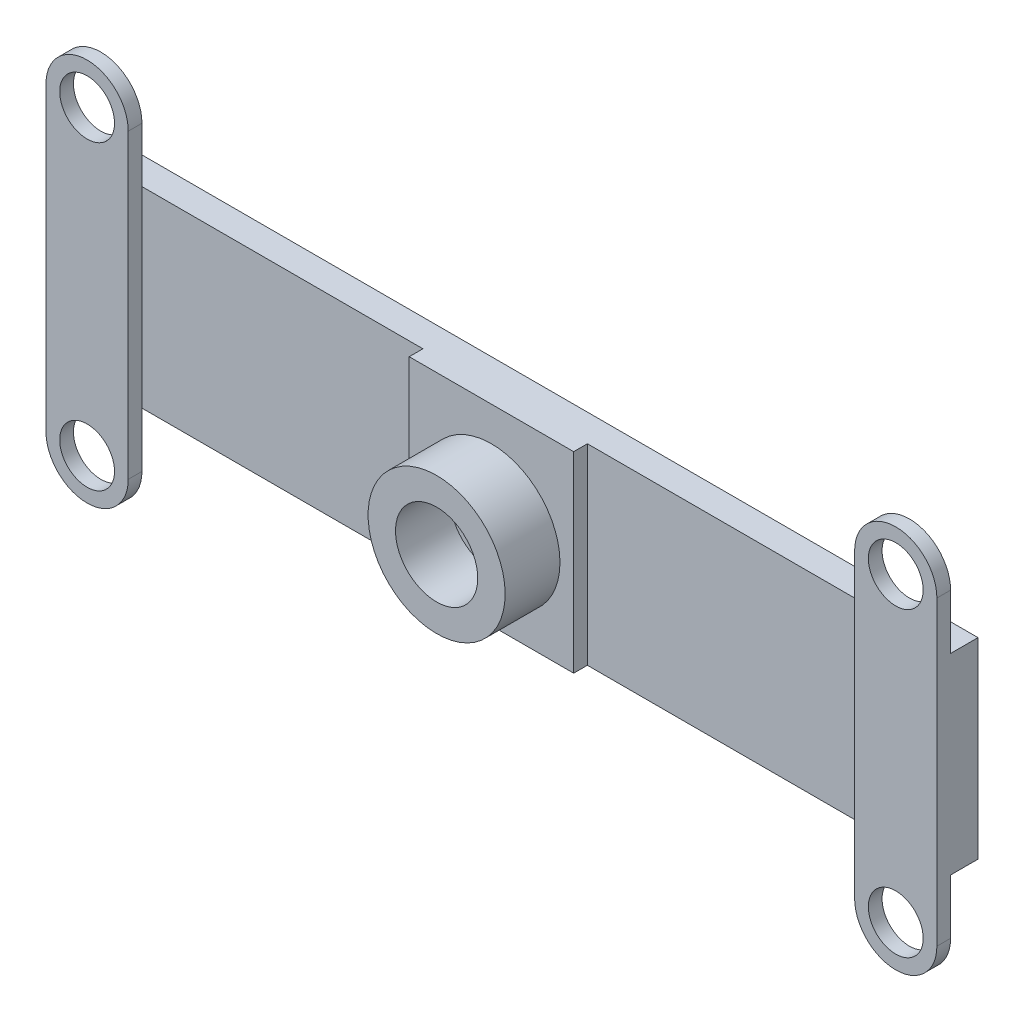
ISO-10303-21;
HEADER;
FILE_DESCRIPTION(('STEP AP214'),'2;1');
FILE_NAME('part.step','',(''),(''),'','','');
FILE_SCHEMA(('AUTOMOTIVE_DESIGN { 1 0 10303 214 1 1 1 1 }'));
ENDSEC;
DATA;
#1=APPLICATION_CONTEXT('core data for automotive mechanical design processes');
#2=APPLICATION_PROTOCOL_DEFINITION('international standard','automotive_design',2000,#1);
#3=PRODUCT_CONTEXT('',#1,'mechanical');
#4=PRODUCT('Part','Part','',(#3));
#5=PRODUCT_RELATED_PRODUCT_CATEGORY('part','',(#4));
#6=PRODUCT_DEFINITION_FORMATION('','',#4);
#7=PRODUCT_DEFINITION_CONTEXT('part definition',#1,'design');
#8=PRODUCT_DEFINITION('design','',#6,#7);
#9=PRODUCT_DEFINITION_SHAPE('','',#8);
#10=(LENGTH_UNIT() NAMED_UNIT(*) SI_UNIT(.MILLI.,.METRE.));
#11=(NAMED_UNIT(*) PLANE_ANGLE_UNIT() SI_UNIT($,.RADIAN.));
#12=(NAMED_UNIT(*) SI_UNIT($,.STERADIAN.) SOLID_ANGLE_UNIT());
#13=UNCERTAINTY_MEASURE_WITH_UNIT(LENGTH_MEASURE(1.E-05),#10,'distance_accuracy_value','');
#14=(GEOMETRIC_REPRESENTATION_CONTEXT(3) GLOBAL_UNCERTAINTY_ASSIGNED_CONTEXT((#13)) GLOBAL_UNIT_ASSIGNED_CONTEXT((#10,
#11,#12)) REPRESENTATION_CONTEXT('',''));
#15=CARTESIAN_POINT('',(0.,0.,0.));
#16=DIRECTION('',(0.,0.,1.));
#17=DIRECTION('',(1.,0.,0.));
#18=AXIS2_PLACEMENT_3D('',#15,#16,#17);
#19=CARTESIAN_POINT('',(0.,0.,3.));
#20=DIRECTION('',(0.,0.,1.));
#21=DIRECTION('',(1.,0.,0.));
#22=AXIS2_PLACEMENT_3D('',#19,#20,#21);
#23=PLANE('',#22);
#24=CARTESIAN_POINT('',(-6.93546936709995,10.3214865942249,3.));
#25=DIRECTION('',(0.,0.,1.));
#26=DIRECTION('',(1.,0.,0.));
#27=AXIS2_PLACEMENT_3D('',#24,#25,#26);
#28=CIRCLE('',#27,2.);
#29=CARTESIAN_POINT('',(-4.93546936709994,10.3214865942249,3.));
#30=VERTEX_POINT('',#29);
#31=EDGE_CURVE('E240',#30,#30,#28,.T.);
#32=ORIENTED_EDGE('',*,*,#31,.F.);
#33=EDGE_LOOP('',(#32));
#34=FACE_BOUND('',#33,.T.);
#35=CARTESIAN_POINT('',(-6.93546936709995,9.82148659422492,3.));
#36=DIRECTION('',(0.,0.,1.));
#37=DIRECTION('',(1.,0.,0.));
#38=AXIS2_PLACEMENT_3D('',#35,#36,#37);
#39=CIRCLE('',#38,3.);
#40=CARTESIAN_POINT('',(-3.93546936709995,9.82148659422492,3.));
#41=VERTEX_POINT('',#40);
#42=EDGE_CURVE('E361',#41,#41,#39,.T.);
#43=ORIENTED_EDGE('',*,*,#42,.T.);
#44=EDGE_LOOP('',(#43));
#45=FACE_BOUND('',#44,.T.);
#46=ADVANCED_FACE('F33',(#34,#45),#23,.T.);
#47=CARTESIAN_POINT('',(0.,0.,2.));
#48=DIRECTION('',(0.,0.,1.));
#49=DIRECTION('',(1.,0.,0.));
#50=AXIS2_PLACEMENT_3D('',#47,#48,#49);
#51=PLANE('',#50);
#52=DIRECTION('',(1.,0.,0.));
#53=VECTOR('',#52,1.);
#54=CARTESIAN_POINT('',(-39.4354693670999,3.32148659422492,2.));
#55=LINE('',#54,#53);
#56=CARTESIAN_POINT('',(-0.935469367099942,3.32148659422492,2.));
#57=VERTEX_POINT('',#56);
#58=CARTESIAN_POINT('',(19.5645306329001,3.32148659422492,2.));
#59=VERTEX_POINT('',#58);
#60=EDGE_CURVE('E279',#57,#59,#55,.T.);
#61=ORIENTED_EDGE('',*,*,#60,.T.);
#62=DIRECTION('',(0.,-1.,0.));
#63=VECTOR('',#62,1.);
#64=CARTESIAN_POINT('',(19.5645306329001,21.3214865942249,2.));
#65=LINE('',#64,#63);
#66=CARTESIAN_POINT('',(19.5645306329001,17.3214865942249,2.));
#67=VERTEX_POINT('',#66);
#68=EDGE_CURVE('E339',#67,#59,#65,.T.);
#69=ORIENTED_EDGE('',*,*,#68,.F.);
#70=DIRECTION('',(-1.,0.,0.));
#71=VECTOR('',#70,1.);
#72=CARTESIAN_POINT('',(-39.4354693670999,17.3214865942249,2.));
#73=LINE('',#72,#71);
#74=CARTESIAN_POINT('',(-0.935469367099942,17.3214865942249,2.));
#75=VERTEX_POINT('',#74);
#76=EDGE_CURVE('E284',#67,#75,#73,.T.);
#77=ORIENTED_EDGE('',*,*,#76,.T.);
#78=DIRECTION('',(0.,1.,0.));
#79=VECTOR('',#78,1.);
#80=CARTESIAN_POINT('',(-0.935469367099942,17.3214865942249,2.));
#81=LINE('',#80,#79);
#82=EDGE_CURVE('E248',#57,#75,#81,.T.);
#83=ORIENTED_EDGE('',*,*,#82,.F.);
#84=EDGE_LOOP('',(#61,#69,#77,#83));
#85=FACE_BOUND('',#84,.T.);
#86=ADVANCED_FACE('F387',(#85),#51,.T.);
#87=CARTESIAN_POINT('',(-12.9354693671,17.3214865942249,2.));
#88=VERTEX_POINT('',#87);
#89=CARTESIAN_POINT('',(-33.4354693670999,17.3214865942249,2.));
#90=VERTEX_POINT('',#89);
#91=EDGE_CURVE('E285',#88,#90,#73,.T.);
#92=ORIENTED_EDGE('',*,*,#91,.T.);
#93=DIRECTION('',(0.,1.,0.));
#94=VECTOR('',#93,1.);
#95=CARTESIAN_POINT('',(-33.4354693670999,21.3214865942249,2.));
#96=LINE('',#95,#94);
#97=CARTESIAN_POINT('',(-33.4354693670999,3.32148659422492,2.));
#98=VERTEX_POINT('',#97);
#99=EDGE_CURVE('E57',#98,#90,#96,.T.);
#100=ORIENTED_EDGE('',*,*,#99,.F.);
#101=CARTESIAN_POINT('',(-12.9354693671,3.32148659422492,2.));
#102=VERTEX_POINT('',#101);
#103=EDGE_CURVE('E278',#98,#102,#55,.T.);
#104=ORIENTED_EDGE('',*,*,#103,.T.);
#105=DIRECTION('',(0.,-1.,0.));
#106=VECTOR('',#105,1.);
#107=CARTESIAN_POINT('',(-12.9354693671,17.3214865942249,2.));
#108=LINE('',#107,#106);
#109=EDGE_CURVE('E243',#88,#102,#108,.T.);
#110=ORIENTED_EDGE('',*,*,#109,.F.);
#111=EDGE_LOOP('',(#92,#100,#104,#110));
#112=FACE_BOUND('',#111,.T.);
#113=ADVANCED_FACE('F394',(#112),#51,.T.);
#114=CARTESIAN_POINT('',(0.,0.,0.));
#115=DIRECTION('',(0.,0.,1.));
#116=DIRECTION('',(1.,0.,0.));
#117=AXIS2_PLACEMENT_3D('',#114,#115,#116);
#118=PLANE('',#117);
#119=DIRECTION('',(0.,-1.,0.));
#120=VECTOR('',#119,1.);
#121=CARTESIAN_POINT('',(-39.4354693670999,17.3214865942249,0.));
#122=LINE('',#121,#120);
#123=CARTESIAN_POINT('',(-39.4354693670999,17.3214865942249,0.));
#124=VERTEX_POINT('',#123);
#125=CARTESIAN_POINT('',(-39.4354693670999,3.32148659422492,0.));
#126=VERTEX_POINT('',#125);
#127=EDGE_CURVE('E273',#124,#126,#122,.T.);
#128=ORIENTED_EDGE('',*,*,#127,.F.);
#129=DIRECTION('',(-1.,0.,0.));
#130=VECTOR('',#129,1.);
#131=CARTESIAN_POINT('',(-39.4354693670999,17.3214865942249,0.));
#132=LINE('',#131,#130);
#133=CARTESIAN_POINT('',(25.5645306329001,17.3214865942249,0.));
#134=VERTEX_POINT('',#133);
#135=EDGE_CURVE('E292',#134,#124,#132,.T.);
#136=ORIENTED_EDGE('',*,*,#135,.F.);
#137=DIRECTION('',(0.,1.,0.));
#138=VECTOR('',#137,1.);
#139=CARTESIAN_POINT('',(25.5645306329001,17.3214865942249,0.));
#140=LINE('',#139,#138);
#141=CARTESIAN_POINT('',(25.5645306329001,3.32148659422492,0.));
#142=VERTEX_POINT('',#141);
#143=EDGE_CURVE('E290',#142,#134,#140,.T.);
#144=ORIENTED_EDGE('',*,*,#143,.F.);
#145=DIRECTION('',(1.,0.,0.));
#146=VECTOR('',#145,1.);
#147=CARTESIAN_POINT('',(-39.4354693670999,3.32148659422492,0.));
#148=LINE('',#147,#146);
#149=EDGE_CURVE('E288',#126,#142,#148,.T.);
#150=ORIENTED_EDGE('',*,*,#149,.F.);
#151=EDGE_LOOP('',(#128,#136,#144,#150));
#152=FACE_BOUND('',#151,.T.);
#153=CARTESIAN_POINT('',(-6.93546936709995,10.3214865942249,0.));
#154=DIRECTION('',(0.,0.,1.));
#155=DIRECTION('',(1.,0.,0.));
#156=AXIS2_PLACEMENT_3D('',#153,#154,#155);
#157=CIRCLE('',#156,2.);
#158=CARTESIAN_POINT('',(-4.93546936709995,10.3214865942249,0.));
#159=VERTEX_POINT('',#158);
#160=EDGE_CURVE('E270',#159,#159,#157,.T.);
#161=ORIENTED_EDGE('',*,*,#160,.T.);
#162=EDGE_LOOP('',(#161));
#163=FACE_BOUND('',#162,.T.);
#164=ADVANCED_FACE('F311',(#152,#163),#118,.F.);
#165=CARTESIAN_POINT('',(-39.4354693670999,17.3214865942249,2.));
#166=DIRECTION('',(1.,0.,0.));
#167=DIRECTION('',(0.,0.,-1.));
#168=AXIS2_PLACEMENT_3D('',#165,#166,#167);
#169=PLANE('',#168);
#170=ORIENTED_EDGE('',*,*,#127,.T.);
#171=DIRECTION('',(0.,0.,-1.));
#172=VECTOR('',#171,1.);
#173=CARTESIAN_POINT('',(-39.4354693670999,3.32148659422492,2.));
#174=LINE('',#173,#172);
#175=CARTESIAN_POINT('',(-39.4354693670999,3.32148659422492,2.));
#176=VERTEX_POINT('',#175);
#177=EDGE_CURVE('E37',#176,#126,#174,.T.);
#178=ORIENTED_EDGE('',*,*,#177,.F.);
#179=DIRECTION('',(0.,-1.,0.));
#180=VECTOR('',#179,1.);
#181=CARTESIAN_POINT('',(-39.4354693671,21.3214865942249,2.));
#182=LINE('',#181,#180);
#183=CARTESIAN_POINT('',(-39.4354693671,-0.678513405775075,2.));
#184=VERTEX_POINT('',#183);
#185=EDGE_CURVE('E226',#176,#184,#182,.T.);
#186=ORIENTED_EDGE('',*,*,#185,.T.);
#187=DIRECTION('',(0.,0.,-1.));
#188=VECTOR('',#187,1.);
#189=CARTESIAN_POINT('',(-39.4354693671,-0.678513405775075,3.));
#190=LINE('',#189,#188);
#191=CARTESIAN_POINT('',(-39.4354693671,-0.678513405775075,3.));
#192=VERTEX_POINT('',#191);
#193=EDGE_CURVE('E217',#192,#184,#190,.T.);
#194=ORIENTED_EDGE('',*,*,#193,.F.);
#195=DIRECTION('',(0.,-1.,0.));
#196=VECTOR('',#195,1.);
#197=CARTESIAN_POINT('',(-39.4354693671,21.3214865942249,3.));
#198=LINE('',#197,#196);
#199=CARTESIAN_POINT('',(-39.4354693671,21.3214865942249,3.));
#200=VERTEX_POINT('',#199);
#201=EDGE_CURVE('E215',#200,#192,#198,.T.);
#202=ORIENTED_EDGE('',*,*,#201,.F.);
#203=DIRECTION('',(0.,0.,-1.));
#204=VECTOR('',#203,1.);
#205=CARTESIAN_POINT('',(-39.4354693671,21.3214865942249,3.));
#206=LINE('',#205,#204);
#207=CARTESIAN_POINT('',(-39.4354693671,21.3214865942249,2.));
#208=VERTEX_POINT('',#207);
#209=EDGE_CURVE('E231',#200,#208,#206,.T.);
#210=ORIENTED_EDGE('',*,*,#209,.T.);
#211=CARTESIAN_POINT('',(-39.4354693671,17.3214865942249,2.));
#212=VERTEX_POINT('',#211);
#213=EDGE_CURVE('E211',#208,#212,#182,.T.);
#214=ORIENTED_EDGE('',*,*,#213,.T.);
#215=DIRECTION('',(0.,0.,-1.));
#216=VECTOR('',#215,1.);
#217=CARTESIAN_POINT('',(-39.4354693670999,17.3214865942249,2.));
#218=LINE('',#217,#216);
#219=EDGE_CURVE('E283',#212,#124,#218,.T.);
#220=ORIENTED_EDGE('',*,*,#219,.T.);
#221=EDGE_LOOP('',(#170,#178,#186,#194,#202,#210,#214,#220));
#222=FACE_BOUND('',#221,.T.);
#223=ADVANCED_FACE('F35',(#222),#169,.F.);
#224=CARTESIAN_POINT('',(-39.4354693670999,3.32148659422492,2.));
#225=DIRECTION('',(0.,1.,0.));
#226=DIRECTION('',(0.,0.,1.));
#227=AXIS2_PLACEMENT_3D('',#224,#225,#226);
#228=PLANE('',#227);
#229=ORIENTED_EDGE('',*,*,#149,.T.);
#230=DIRECTION('',(0.,0.,-1.));
#231=VECTOR('',#230,1.);
#232=CARTESIAN_POINT('',(25.5645306329001,3.32148659422492,2.));
#233=LINE('',#232,#231);
#234=CARTESIAN_POINT('',(25.5645306329001,3.32148659422492,2.));
#235=VERTEX_POINT('',#234);
#236=EDGE_CURVE('E298',#235,#142,#233,.T.);
#237=ORIENTED_EDGE('',*,*,#236,.F.);
#238=DIRECTION('',(1.,0.,0.));
#239=VECTOR('',#238,1.);
#240=CARTESIAN_POINT('',(-39.4354693670999,3.32148659422492,2.));
#241=LINE('',#240,#239);
#242=EDGE_CURVE('E49',#59,#235,#241,.T.);
#243=ORIENTED_EDGE('',*,*,#242,.F.);
#244=ORIENTED_EDGE('',*,*,#60,.F.);
#245=DIRECTION('',(0.,0.,-1.));
#246=VECTOR('',#245,1.);
#247=CARTESIAN_POINT('',(-0.935469367099942,3.32148659422492,3.));
#248=LINE('',#247,#246);
#249=CARTESIAN_POINT('',(-0.935469367099942,3.32148659422492,3.));
#250=VERTEX_POINT('',#249);
#251=EDGE_CURVE('E264',#250,#57,#248,.T.);
#252=ORIENTED_EDGE('',*,*,#251,.F.);
#253=DIRECTION('',(1.,0.,0.));
#254=VECTOR('',#253,1.);
#255=CARTESIAN_POINT('',(-12.9354693670999,3.32148659422492,3.));
#256=LINE('',#255,#254);
#257=CARTESIAN_POINT('',(-12.9354693670999,3.32148659422492,3.));
#258=VERTEX_POINT('',#257);
#259=EDGE_CURVE('E247',#258,#250,#256,.T.);
#260=ORIENTED_EDGE('',*,*,#259,.F.);
#261=DIRECTION('',(0.,0.,-1.));
#262=VECTOR('',#261,1.);
#263=CARTESIAN_POINT('',(-12.9354693670999,3.32148659422492,3.));
#264=LINE('',#263,#262);
#265=EDGE_CURVE('E267',#258,#102,#264,.T.);
#266=ORIENTED_EDGE('',*,*,#265,.T.);
#267=ORIENTED_EDGE('',*,*,#103,.F.);
#268=EDGE_CURVE('E274',#176,#98,#55,.T.);
#269=ORIENTED_EDGE('',*,*,#268,.F.);
#270=ORIENTED_EDGE('',*,*,#177,.T.);
#271=EDGE_LOOP('',(#229,#237,#243,#244,#252,#260,#266,#267,#269,#270));
#272=FACE_BOUND('',#271,.T.);
#273=ADVANCED_FACE('F305',(#272),#228,.F.);
#274=CARTESIAN_POINT('',(25.5645306329001,17.3214865942249,2.));
#275=DIRECTION('',(-1.,0.,0.));
#276=DIRECTION('',(0.,0.,1.));
#277=AXIS2_PLACEMENT_3D('',#274,#275,#276);
#278=PLANE('',#277);
#279=ORIENTED_EDGE('',*,*,#143,.T.);
#280=DIRECTION('',(0.,0.,-1.));
#281=VECTOR('',#280,1.);
#282=CARTESIAN_POINT('',(25.5645306329001,17.3214865942249,2.));
#283=LINE('',#282,#281);
#284=CARTESIAN_POINT('',(25.5645306329001,17.3214865942249,2.));
#285=VERTEX_POINT('',#284);
#286=EDGE_CURVE('E296',#285,#134,#283,.T.);
#287=ORIENTED_EDGE('',*,*,#286,.F.);
#288=DIRECTION('',(0.,1.,0.));
#289=VECTOR('',#288,1.);
#290=CARTESIAN_POINT('',(25.5645306329001,21.3214865942249,2.));
#291=LINE('',#290,#289);
#292=CARTESIAN_POINT('',(25.5645306329001,21.3214865942249,2.));
#293=VERTEX_POINT('',#292);
#294=EDGE_CURVE('E320',#285,#293,#291,.T.);
#295=ORIENTED_EDGE('',*,*,#294,.T.);
#296=DIRECTION('',(0.,0.,-1.));
#297=VECTOR('',#296,1.);
#298=CARTESIAN_POINT('',(25.5645306329001,21.3214865942249,3.));
#299=LINE('',#298,#297);
#300=CARTESIAN_POINT('',(25.5645306329001,21.3214865942249,3.));
#301=VERTEX_POINT('',#300);
#302=EDGE_CURVE('E328',#301,#293,#299,.T.);
#303=ORIENTED_EDGE('',*,*,#302,.F.);
#304=DIRECTION('',(0.,1.,0.));
#305=VECTOR('',#304,1.);
#306=CARTESIAN_POINT('',(25.5645306329001,21.3214865942249,3.));
#307=LINE('',#306,#305);
#308=CARTESIAN_POINT('',(25.5645306329001,-0.678513405775086,3.));
#309=VERTEX_POINT('',#308);
#310=EDGE_CURVE('E179',#309,#301,#307,.T.);
#311=ORIENTED_EDGE('',*,*,#310,.F.);
#312=DIRECTION('',(0.,0.,-1.));
#313=VECTOR('',#312,1.);
#314=CARTESIAN_POINT('',(25.5645306329001,-0.678513405775086,3.));
#315=LINE('',#314,#313);
#316=CARTESIAN_POINT('',(25.5645306329001,-0.678513405775086,2.));
#317=VERTEX_POINT('',#316);
#318=EDGE_CURVE('E191',#309,#317,#315,.T.);
#319=ORIENTED_EDGE('',*,*,#318,.T.);
#320=EDGE_CURVE('E183',#317,#235,#291,.T.);
#321=ORIENTED_EDGE('',*,*,#320,.T.);
#322=ORIENTED_EDGE('',*,*,#236,.T.);
#323=EDGE_LOOP('',(#279,#287,#295,#303,#311,#319,#321,#322));
#324=FACE_BOUND('',#323,.T.);
#325=ADVANCED_FACE('F313',(#324),#278,.F.);
#326=CARTESIAN_POINT('',(-39.4354693670999,17.3214865942249,2.));
#327=DIRECTION('',(0.,-1.,0.));
#328=DIRECTION('',(0.,0.,-1.));
#329=AXIS2_PLACEMENT_3D('',#326,#327,#328);
#330=PLANE('',#329);
#331=ORIENTED_EDGE('',*,*,#135,.T.);
#332=ORIENTED_EDGE('',*,*,#219,.F.);
#333=EDGE_CURVE('E277',#90,#212,#73,.T.);
#334=ORIENTED_EDGE('',*,*,#333,.F.);
#335=ORIENTED_EDGE('',*,*,#91,.F.);
#336=DIRECTION('',(0.,0.,-1.));
#337=VECTOR('',#336,1.);
#338=CARTESIAN_POINT('',(-12.9354693671,17.3214865942249,3.));
#339=LINE('',#338,#337);
#340=CARTESIAN_POINT('',(-12.9354693671,17.3214865942249,3.));
#341=VERTEX_POINT('',#340);
#342=EDGE_CURVE('E254',#341,#88,#339,.T.);
#343=ORIENTED_EDGE('',*,*,#342,.F.);
#344=DIRECTION('',(-1.,0.,0.));
#345=VECTOR('',#344,1.);
#346=CARTESIAN_POINT('',(-12.9354693671,17.3214865942249,3.));
#347=LINE('',#346,#345);
#348=CARTESIAN_POINT('',(-0.935469367099942,17.3214865942249,3.));
#349=VERTEX_POINT('',#348);
#350=EDGE_CURVE('E252',#349,#341,#347,.T.);
#351=ORIENTED_EDGE('',*,*,#350,.F.);
#352=DIRECTION('',(0.,0.,-1.));
#353=VECTOR('',#352,1.);
#354=CARTESIAN_POINT('',(-0.935469367099942,17.3214865942249,3.));
#355=LINE('',#354,#353);
#356=EDGE_CURVE('E261',#349,#75,#355,.T.);
#357=ORIENTED_EDGE('',*,*,#356,.T.);
#358=ORIENTED_EDGE('',*,*,#76,.F.);
#359=EDGE_CURVE('E280',#285,#67,#73,.T.);
#360=ORIENTED_EDGE('',*,*,#359,.F.);
#361=ORIENTED_EDGE('',*,*,#286,.T.);
#362=EDGE_LOOP('',(#331,#332,#334,#335,#343,#351,#357,#358,#360,#361));
#363=FACE_BOUND('',#362,.T.);
#364=ADVANCED_FACE('F316',(#363),#330,.F.);
#365=CARTESIAN_POINT('',(-6.93546936709995,10.3214865942249,2.));
#366=DIRECTION('',(0.,0.,-1.));
#367=DIRECTION('',(-1.,0.,0.));
#368=AXIS2_PLACEMENT_3D('',#365,#366,#367);
#369=CYLINDRICAL_SURFACE('',#368,2.);
#370=ORIENTED_EDGE('',*,*,#160,.F.);
#371=EDGE_LOOP('',(#370));
#372=FACE_BOUND('',#371,.T.);
#373=ORIENTED_EDGE('',*,*,#31,.T.);
#374=EDGE_LOOP('',(#373));
#375=FACE_BOUND('',#374,.T.);
#376=ADVANCED_FACE('F402',(#372,#375),#369,.F.);
#377=CARTESIAN_POINT('',(-6.93546936709995,9.82148659422492,3.));
#378=DIRECTION('',(0.,0.,1.));
#379=DIRECTION('',(1.,0.,0.));
#380=AXIS2_PLACEMENT_3D('',#377,#378,#379);
#381=CIRCLE('',#380,5.);
#382=CARTESIAN_POINT('',(-1.93546936709995,9.82148659422492,3.));
#383=VERTEX_POINT('',#382);
#384=EDGE_CURVE('E11',#383,#383,#381,.T.);
#385=ORIENTED_EDGE('',*,*,#384,.F.);
#386=EDGE_LOOP('',(#385));
#387=FACE_BOUND('',#386,.T.);
#388=DIRECTION('',(0.,-1.,0.));
#389=VECTOR('',#388,1.);
#390=CARTESIAN_POINT('',(-12.9354693671,17.3214865942249,3.));
#391=LINE('',#390,#389);
#392=EDGE_CURVE('E244',#341,#258,#391,.T.);
#393=ORIENTED_EDGE('',*,*,#392,.T.);
#394=ORIENTED_EDGE('',*,*,#259,.T.);
#395=DIRECTION('',(0.,1.,0.));
#396=VECTOR('',#395,1.);
#397=CARTESIAN_POINT('',(-0.935469367099942,17.3214865942249,3.));
#398=LINE('',#397,#396);
#399=EDGE_CURVE('E250',#250,#349,#398,.T.);
#400=ORIENTED_EDGE('',*,*,#399,.T.);
#401=ORIENTED_EDGE('',*,*,#350,.T.);
#402=EDGE_LOOP('',(#393,#394,#400,#401));
#403=FACE_BOUND('',#402,.T.);
#404=ADVANCED_FACE('F390',(#387,#403),#23,.T.);
#405=CARTESIAN_POINT('',(-12.9354693671,17.3214865942249,3.));
#406=DIRECTION('',(1.,0.,0.));
#407=DIRECTION('',(0.,1.,0.));
#408=AXIS2_PLACEMENT_3D('',#405,#406,#407);
#409=PLANE('',#408);
#410=ORIENTED_EDGE('',*,*,#109,.T.);
#411=ORIENTED_EDGE('',*,*,#265,.F.);
#412=ORIENTED_EDGE('',*,*,#392,.F.);
#413=ORIENTED_EDGE('',*,*,#342,.T.);
#414=EDGE_LOOP('',(#410,#411,#412,#413));
#415=FACE_BOUND('',#414,.T.);
#416=ADVANCED_FACE('F401',(#415),#409,.F.);
#417=CARTESIAN_POINT('',(-0.935469367099942,17.3214865942249,3.));
#418=DIRECTION('',(-1.,0.,0.));
#419=DIRECTION('',(0.,0.,1.));
#420=AXIS2_PLACEMENT_3D('',#417,#418,#419);
#421=PLANE('',#420);
#422=ORIENTED_EDGE('',*,*,#82,.T.);
#423=ORIENTED_EDGE('',*,*,#356,.F.);
#424=ORIENTED_EDGE('',*,*,#399,.F.);
#425=ORIENTED_EDGE('',*,*,#251,.T.);
#426=EDGE_LOOP('',(#422,#423,#424,#425));
#427=FACE_BOUND('',#426,.T.);
#428=ADVANCED_FACE('F408',(#427),#421,.F.);
#429=CARTESIAN_POINT('',(-36.4354693670999,-0.678513405775074,2.));
#430=DIRECTION('',(0.,0.,1.));
#431=DIRECTION('',(1.,0.,0.));
#432=AXIS2_PLACEMENT_3D('',#429,#430,#431);
#433=PLANE('',#432);
#434=CARTESIAN_POINT('',(-36.4354693670999,-0.678513405775074,2.));
#435=DIRECTION('',(0.,0.,1.));
#436=DIRECTION('',(1.,0.,0.));
#437=AXIS2_PLACEMENT_3D('',#434,#435,#436);
#438=CIRCLE('',#437,2.);
#439=CARTESIAN_POINT('',(-34.4354693670999,-0.678513405775074,2.));
#440=VERTEX_POINT('',#439);
#441=EDGE_CURVE('E189',#440,#440,#438,.T.);
#442=ORIENTED_EDGE('',*,*,#441,.T.);
#443=EDGE_LOOP('',(#442));
#444=FACE_BOUND('',#443,.T.);
#445=ORIENTED_EDGE('',*,*,#185,.F.);
#446=ORIENTED_EDGE('',*,*,#268,.T.);
#447=CARTESIAN_POINT('',(-33.4354693670999,-0.678513405775074,2.));
#448=VERTEX_POINT('',#447);
#449=EDGE_CURVE('E221',#448,#98,#96,.T.);
#450=ORIENTED_EDGE('',*,*,#449,.F.);
#451=CARTESIAN_POINT('',(-36.4354693670999,-0.678513405775074,2.));
#452=DIRECTION('',(0.,0.,1.));
#453=DIRECTION('',(1.,0.,0.));
#454=AXIS2_PLACEMENT_3D('',#451,#452,#453);
#455=CIRCLE('',#454,3.00000000000002);
#456=EDGE_CURVE('E204',#184,#448,#455,.T.);
#457=ORIENTED_EDGE('',*,*,#456,.F.);
#458=EDGE_LOOP('',(#445,#446,#450,#457));
#459=FACE_BOUND('',#458,.T.);
#460=ADVANCED_FACE('F442',(#444,#459),#433,.F.);
#461=CARTESIAN_POINT('',(-36.4354693671,21.3214865942249,2.));
#462=DIRECTION('',(0.,0.,1.));
#463=DIRECTION('',(1.,0.,0.));
#464=AXIS2_PLACEMENT_3D('',#461,#462,#463);
#465=CIRCLE('',#464,2.);
#466=CARTESIAN_POINT('',(-34.4354693670999,21.3214865942249,2.));
#467=VERTEX_POINT('',#466);
#468=EDGE_CURVE('E198',#467,#467,#465,.T.);
#469=ORIENTED_EDGE('',*,*,#468,.T.);
#470=EDGE_LOOP('',(#469));
#471=FACE_BOUND('',#470,.T.);
#472=CARTESIAN_POINT('',(-33.4354693670999,21.3214865942249,2.));
#473=VERTEX_POINT('',#472);
#474=EDGE_CURVE('E220',#90,#473,#96,.T.);
#475=ORIENTED_EDGE('',*,*,#474,.F.);
#476=ORIENTED_EDGE('',*,*,#333,.T.);
#477=ORIENTED_EDGE('',*,*,#213,.F.);
#478=CARTESIAN_POINT('',(-36.4354693671,21.3214865942249,2.));
#479=DIRECTION('',(0.,0.,1.));
#480=DIRECTION('',(1.,0.,0.));
#481=AXIS2_PLACEMENT_3D('',#478,#479,#480);
#482=CIRCLE('',#481,3.);
#483=EDGE_CURVE('E224',#473,#208,#482,.T.);
#484=ORIENTED_EDGE('',*,*,#483,.F.);
#485=EDGE_LOOP('',(#475,#476,#477,#484));
#486=FACE_BOUND('',#485,.T.);
#487=ADVANCED_FACE('F428',(#471,#486),#433,.F.);
#488=CARTESIAN_POINT('',(-36.4354693670999,-0.678513405775074,3.));
#489=DIRECTION('',(0.,0.,1.));
#490=DIRECTION('',(1.,0.,0.));
#491=AXIS2_PLACEMENT_3D('',#488,#489,#490);
#492=PLANE('',#491);
#493=CARTESIAN_POINT('',(-36.4354693671,21.3214865942249,3.));
#494=DIRECTION('',(0.,0.,1.));
#495=DIRECTION('',(1.,0.,0.));
#496=AXIS2_PLACEMENT_3D('',#493,#494,#495);
#497=CIRCLE('',#496,2.);
#498=CARTESIAN_POINT('',(-34.4354693670999,21.3214865942249,3.));
#499=VERTEX_POINT('',#498);
#500=EDGE_CURVE('E201',#499,#499,#497,.T.);
#501=ORIENTED_EDGE('',*,*,#500,.F.);
#502=EDGE_LOOP('',(#501));
#503=FACE_BOUND('',#502,.T.);
#504=CARTESIAN_POINT('',(-36.4354693670999,-0.678513405775074,3.));
#505=DIRECTION('',(0.,0.,1.));
#506=DIRECTION('',(1.,0.,0.));
#507=AXIS2_PLACEMENT_3D('',#504,#505,#506);
#508=CIRCLE('',#507,3.00000000000002);
#509=CARTESIAN_POINT('',(-33.4354693670999,-0.678513405775074,3.));
#510=VERTEX_POINT('',#509);
#511=EDGE_CURVE('E207',#192,#510,#508,.T.);
#512=ORIENTED_EDGE('',*,*,#511,.T.);
#513=DIRECTION('',(0.,1.,0.));
#514=VECTOR('',#513,1.);
#515=CARTESIAN_POINT('',(-33.4354693670999,21.3214865942249,3.));
#516=LINE('',#515,#514);
#517=CARTESIAN_POINT('',(-33.4354693670999,21.3214865942249,3.));
#518=VERTEX_POINT('',#517);
#519=EDGE_CURVE('E210',#510,#518,#516,.T.);
#520=ORIENTED_EDGE('',*,*,#519,.T.);
#521=CARTESIAN_POINT('',(-36.4354693671,21.3214865942249,3.));
#522=DIRECTION('',(0.,0.,1.));
#523=DIRECTION('',(1.,0.,0.));
#524=AXIS2_PLACEMENT_3D('',#521,#522,#523);
#525=CIRCLE('',#524,3.);
#526=EDGE_CURVE('E213',#518,#200,#525,.T.);
#527=ORIENTED_EDGE('',*,*,#526,.T.);
#528=ORIENTED_EDGE('',*,*,#201,.T.);
#529=EDGE_LOOP('',(#512,#520,#527,#528));
#530=FACE_BOUND('',#529,.T.);
#531=CARTESIAN_POINT('',(-36.4354693670999,-0.678513405775074,3.));
#532=DIRECTION('',(0.,0.,1.));
#533=DIRECTION('',(1.,0.,0.));
#534=AXIS2_PLACEMENT_3D('',#531,#532,#533);
#535=CIRCLE('',#534,2.);
#536=CARTESIAN_POINT('',(-34.4354693670999,-0.678513405775074,3.));
#537=VERTEX_POINT('',#536);
#538=EDGE_CURVE('E195',#537,#537,#535,.T.);
#539=ORIENTED_EDGE('',*,*,#538,.F.);
#540=EDGE_LOOP('',(#539));
#541=FACE_BOUND('',#540,.T.);
#542=ADVANCED_FACE('F447',(#503,#530,#541),#492,.T.);
#543=CARTESIAN_POINT('',(-36.4354693670999,-0.678513405775074,3.));
#544=DIRECTION('',(0.,0.,-1.));
#545=DIRECTION('',(-1.,0.,0.));
#546=AXIS2_PLACEMENT_3D('',#543,#544,#545);
#547=CYLINDRICAL_SURFACE('',#546,3.00000000000002);
#548=ORIENTED_EDGE('',*,*,#456,.T.);
#549=DIRECTION('',(0.,0.,-1.));
#550=VECTOR('',#549,1.);
#551=CARTESIAN_POINT('',(-33.4354693670999,-0.678513405775074,3.));
#552=LINE('',#551,#550);
#553=EDGE_CURVE('E237',#510,#448,#552,.T.);
#554=ORIENTED_EDGE('',*,*,#553,.F.);
#555=ORIENTED_EDGE('',*,*,#511,.F.);
#556=ORIENTED_EDGE('',*,*,#193,.T.);
#557=EDGE_LOOP('',(#548,#554,#555,#556));
#558=FACE_BOUND('',#557,.T.);
#559=ADVANCED_FACE('F445',(#558),#547,.T.);
#560=CARTESIAN_POINT('',(-33.4354693670999,21.3214865942249,3.));
#561=DIRECTION('',(-1.,0.,0.));
#562=DIRECTION('',(0.,-1.,0.));
#563=AXIS2_PLACEMENT_3D('',#560,#561,#562);
#564=PLANE('',#563);
#565=ORIENTED_EDGE('',*,*,#449,.T.);
#566=ORIENTED_EDGE('',*,*,#99,.T.);
#567=ORIENTED_EDGE('',*,*,#474,.T.);
#568=DIRECTION('',(0.,0.,-1.));
#569=VECTOR('',#568,1.);
#570=CARTESIAN_POINT('',(-33.4354693670999,21.3214865942249,3.));
#571=LINE('',#570,#569);
#572=EDGE_CURVE('E234',#518,#473,#571,.T.);
#573=ORIENTED_EDGE('',*,*,#572,.F.);
#574=ORIENTED_EDGE('',*,*,#519,.F.);
#575=ORIENTED_EDGE('',*,*,#553,.T.);
#576=EDGE_LOOP('',(#565,#566,#567,#573,#574,#575));
#577=FACE_BOUND('',#576,.T.);
#578=ADVANCED_FACE('F438',(#577),#564,.F.);
#579=CARTESIAN_POINT('',(-36.4354693671,21.3214865942249,3.));
#580=DIRECTION('',(0.,0.,-1.));
#581=DIRECTION('',(-1.,0.,0.));
#582=AXIS2_PLACEMENT_3D('',#579,#580,#581);
#583=CYLINDRICAL_SURFACE('',#582,3.);
#584=ORIENTED_EDGE('',*,*,#483,.T.);
#585=ORIENTED_EDGE('',*,*,#209,.F.);
#586=ORIENTED_EDGE('',*,*,#526,.F.);
#587=ORIENTED_EDGE('',*,*,#572,.T.);
#588=EDGE_LOOP('',(#584,#585,#586,#587));
#589=FACE_BOUND('',#588,.T.);
#590=ADVANCED_FACE('F435',(#589),#583,.T.);
#591=CARTESIAN_POINT('',(-36.4354693671,21.3214865942249,3.));
#592=DIRECTION('',(0.,0.,-1.));
#593=DIRECTION('',(-1.,0.,0.));
#594=AXIS2_PLACEMENT_3D('',#591,#592,#593);
#595=CYLINDRICAL_SURFACE('',#594,2.);
#596=ORIENTED_EDGE('',*,*,#500,.T.);
#597=EDGE_LOOP('',(#596));
#598=FACE_BOUND('',#597,.T.);
#599=ORIENTED_EDGE('',*,*,#468,.F.);
#600=EDGE_LOOP('',(#599));
#601=FACE_BOUND('',#600,.T.);
#602=ADVANCED_FACE('F457',(#598,#601),#595,.F.);
#603=CARTESIAN_POINT('',(-36.4354693670999,-0.678513405775074,3.));
#604=DIRECTION('',(0.,0.,-1.));
#605=DIRECTION('',(-1.,0.,0.));
#606=AXIS2_PLACEMENT_3D('',#603,#604,#605);
#607=CYLINDRICAL_SURFACE('',#606,2.);
#608=ORIENTED_EDGE('',*,*,#538,.T.);
#609=EDGE_LOOP('',(#608));
#610=FACE_BOUND('',#609,.T.);
#611=ORIENTED_EDGE('',*,*,#441,.F.);
#612=EDGE_LOOP('',(#611));
#613=FACE_BOUND('',#612,.T.);
#614=ADVANCED_FACE('F454',(#610,#613),#607,.F.);
#615=CARTESIAN_POINT('',(22.5645306329001,21.3214865942249,2.));
#616=DIRECTION('',(0.,0.,1.));
#617=DIRECTION('',(1.,0.,0.));
#618=AXIS2_PLACEMENT_3D('',#615,#616,#617);
#619=PLANE('',#618);
#620=CARTESIAN_POINT('',(22.5645306329001,-0.678513405775086,2.));
#621=DIRECTION('',(0.,0.,1.));
#622=DIRECTION('',(1.,0.,0.));
#623=AXIS2_PLACEMENT_3D('',#620,#621,#622);
#624=CIRCLE('',#623,2.);
#625=CARTESIAN_POINT('',(24.5645306329001,-0.678513405775086,2.));
#626=VERTEX_POINT('',#625);
#627=EDGE_CURVE('E346',#626,#626,#624,.T.);
#628=ORIENTED_EDGE('',*,*,#627,.T.);
#629=EDGE_LOOP('',(#628));
#630=FACE_BOUND('',#629,.T.);
#631=CARTESIAN_POINT('',(19.5645306329001,-0.678513405775086,2.));
#632=VERTEX_POINT('',#631);
#633=EDGE_CURVE('E337',#59,#632,#65,.T.);
#634=ORIENTED_EDGE('',*,*,#633,.F.);
#635=ORIENTED_EDGE('',*,*,#242,.T.);
#636=ORIENTED_EDGE('',*,*,#320,.F.);
#637=CARTESIAN_POINT('',(22.5645306329001,-0.678513405775086,2.));
#638=DIRECTION('',(0.,0.,1.));
#639=DIRECTION('',(1.,0.,0.));
#640=AXIS2_PLACEMENT_3D('',#637,#638,#639);
#641=CIRCLE('',#640,3.);
#642=EDGE_CURVE('E322',#632,#317,#641,.T.);
#643=ORIENTED_EDGE('',*,*,#642,.F.);
#644=EDGE_LOOP('',(#634,#635,#636,#643));
#645=FACE_BOUND('',#644,.T.);
#646=ADVANCED_FACE('F336',(#630,#645),#619,.F.);
#647=CARTESIAN_POINT('',(22.5645306329001,21.3214865942249,2.));
#648=DIRECTION('',(0.,0.,1.));
#649=DIRECTION('',(1.,0.,0.));
#650=AXIS2_PLACEMENT_3D('',#647,#648,#649);
#651=CIRCLE('',#650,2.);
#652=CARTESIAN_POINT('',(24.5645306329001,21.3214865942249,2.));
#653=VERTEX_POINT('',#652);
#654=EDGE_CURVE('E352',#653,#653,#651,.T.);
#655=ORIENTED_EDGE('',*,*,#654,.T.);
#656=EDGE_LOOP('',(#655));
#657=FACE_BOUND('',#656,.T.);
#658=ORIENTED_EDGE('',*,*,#294,.F.);
#659=ORIENTED_EDGE('',*,*,#359,.T.);
#660=CARTESIAN_POINT('',(19.5645306329001,21.3214865942249,2.));
#661=VERTEX_POINT('',#660);
#662=EDGE_CURVE('E324',#661,#67,#65,.T.);
#663=ORIENTED_EDGE('',*,*,#662,.F.);
#664=CARTESIAN_POINT('',(22.5645306329001,21.3214865942249,2.));
#665=DIRECTION('',(0.,0.,1.));
#666=DIRECTION('',(1.,0.,0.));
#667=AXIS2_PLACEMENT_3D('',#664,#665,#666);
#668=CIRCLE('',#667,3.);
#669=EDGE_CURVE('E187',#293,#661,#668,.T.);
#670=ORIENTED_EDGE('',*,*,#669,.F.);
#671=EDGE_LOOP('',(#658,#659,#663,#670));
#672=FACE_BOUND('',#671,.T.);
#673=ADVANCED_FACE('F321',(#657,#672),#619,.F.);
#674=CARTESIAN_POINT('',(22.5645306329001,21.3214865942249,3.));
#675=DIRECTION('',(0.,0.,1.));
#676=DIRECTION('',(1.,0.,0.));
#677=AXIS2_PLACEMENT_3D('',#674,#675,#676);
#678=PLANE('',#677);
#679=CARTESIAN_POINT('',(22.5645306329001,-0.678513405775086,3.));
#680=DIRECTION('',(0.,0.,1.));
#681=DIRECTION('',(1.,0.,0.));
#682=AXIS2_PLACEMENT_3D('',#679,#680,#681);
#683=CIRCLE('',#682,2.);
#684=CARTESIAN_POINT('',(24.5645306329001,-0.678513405775086,3.));
#685=VERTEX_POINT('',#684);
#686=EDGE_CURVE('E343',#685,#685,#683,.T.);
#687=ORIENTED_EDGE('',*,*,#686,.F.);
#688=EDGE_LOOP('',(#687));
#689=FACE_BOUND('',#688,.T.);
#690=CARTESIAN_POINT('',(22.5645306329001,21.3214865942249,3.));
#691=DIRECTION('',(0.,0.,1.));
#692=DIRECTION('',(1.,0.,0.));
#693=AXIS2_PLACEMENT_3D('',#690,#691,#692);
#694=CIRCLE('',#693,3.);
#695=CARTESIAN_POINT('',(19.5645306329001,21.3214865942249,3.));
#696=VERTEX_POINT('',#695);
#697=EDGE_CURVE('E173',#301,#696,#694,.T.);
#698=ORIENTED_EDGE('',*,*,#697,.T.);
#699=DIRECTION('',(0.,-1.,0.));
#700=VECTOR('',#699,1.);
#701=CARTESIAN_POINT('',(19.5645306329001,21.3214865942249,3.));
#702=LINE('',#701,#700);
#703=CARTESIAN_POINT('',(19.5645306329001,-0.678513405775086,3.));
#704=VERTEX_POINT('',#703);
#705=EDGE_CURVE('E161',#696,#704,#702,.T.);
#706=ORIENTED_EDGE('',*,*,#705,.T.);
#707=CARTESIAN_POINT('',(22.5645306329001,-0.678513405775086,3.));
#708=DIRECTION('',(0.,0.,1.));
#709=DIRECTION('',(1.,0.,0.));
#710=AXIS2_PLACEMENT_3D('',#707,#708,#709);
#711=CIRCLE('',#710,3.);
#712=EDGE_CURVE('E172',#704,#309,#711,.T.);
#713=ORIENTED_EDGE('',*,*,#712,.T.);
#714=ORIENTED_EDGE('',*,*,#310,.T.);
#715=EDGE_LOOP('',(#698,#706,#713,#714));
#716=FACE_BOUND('',#715,.T.);
#717=CARTESIAN_POINT('',(22.5645306329001,21.3214865942249,3.));
#718=DIRECTION('',(0.,0.,1.));
#719=DIRECTION('',(1.,0.,0.));
#720=AXIS2_PLACEMENT_3D('',#717,#718,#719);
#721=CIRCLE('',#720,2.);
#722=CARTESIAN_POINT('',(24.5645306329001,21.3214865942249,3.));
#723=VERTEX_POINT('',#722);
#724=EDGE_CURVE('E349',#723,#723,#721,.T.);
#725=ORIENTED_EDGE('',*,*,#724,.F.);
#726=EDGE_LOOP('',(#725));
#727=FACE_BOUND('',#726,.T.);
#728=ADVANCED_FACE('F176',(#689,#716,#727),#678,.T.);
#729=CARTESIAN_POINT('',(22.5645306329001,21.3214865942249,3.));
#730=DIRECTION('',(0.,0.,-1.));
#731=DIRECTION('',(-1.,0.,0.));
#732=AXIS2_PLACEMENT_3D('',#729,#730,#731);
#733=CYLINDRICAL_SURFACE('',#732,3.);
#734=ORIENTED_EDGE('',*,*,#669,.T.);
#735=DIRECTION('',(0.,0.,-1.));
#736=VECTOR('',#735,1.);
#737=CARTESIAN_POINT('',(19.5645306329001,21.3214865942249,3.));
#738=LINE('',#737,#736);
#739=EDGE_CURVE('E166',#696,#661,#738,.T.);
#740=ORIENTED_EDGE('',*,*,#739,.F.);
#741=ORIENTED_EDGE('',*,*,#697,.F.);
#742=ORIENTED_EDGE('',*,*,#302,.T.);
#743=EDGE_LOOP('',(#734,#740,#741,#742));
#744=FACE_BOUND('',#743,.T.);
#745=ADVANCED_FACE('F185',(#744),#733,.T.);
#746=CARTESIAN_POINT('',(19.5645306329001,21.3214865942249,3.));
#747=DIRECTION('',(1.,0.,0.));
#748=DIRECTION('',(0.,0.,-1.));
#749=AXIS2_PLACEMENT_3D('',#746,#747,#748);
#750=PLANE('',#749);
#751=ORIENTED_EDGE('',*,*,#662,.T.);
#752=ORIENTED_EDGE('',*,*,#68,.T.);
#753=ORIENTED_EDGE('',*,*,#633,.T.);
#754=DIRECTION('',(0.,0.,-1.));
#755=VECTOR('',#754,1.);
#756=CARTESIAN_POINT('',(19.5645306329001,-0.678513405775086,3.));
#757=LINE('',#756,#755);
#758=EDGE_CURVE('E169',#704,#632,#757,.T.);
#759=ORIENTED_EDGE('',*,*,#758,.F.);
#760=ORIENTED_EDGE('',*,*,#705,.F.);
#761=ORIENTED_EDGE('',*,*,#739,.T.);
#762=EDGE_LOOP('',(#751,#752,#753,#759,#760,#761));
#763=FACE_BOUND('',#762,.T.);
#764=ADVANCED_FACE('F164',(#763),#750,.F.);
#765=CARTESIAN_POINT('',(22.5645306329001,-0.678513405775086,3.));
#766=DIRECTION('',(0.,0.,-1.));
#767=DIRECTION('',(-1.,0.,0.));
#768=AXIS2_PLACEMENT_3D('',#765,#766,#767);
#769=CYLINDRICAL_SURFACE('',#768,3.);
#770=ORIENTED_EDGE('',*,*,#642,.T.);
#771=ORIENTED_EDGE('',*,*,#318,.F.);
#772=ORIENTED_EDGE('',*,*,#712,.F.);
#773=ORIENTED_EDGE('',*,*,#758,.T.);
#774=EDGE_LOOP('',(#770,#771,#772,#773));
#775=FACE_BOUND('',#774,.T.);
#776=ADVANCED_FACE('F528',(#775),#769,.T.);
#777=CARTESIAN_POINT('',(22.5645306329001,-0.678513405775086,3.));
#778=DIRECTION('',(0.,0.,-1.));
#779=DIRECTION('',(-1.,0.,0.));
#780=AXIS2_PLACEMENT_3D('',#777,#778,#779);
#781=CYLINDRICAL_SURFACE('',#780,2.);
#782=ORIENTED_EDGE('',*,*,#686,.T.);
#783=EDGE_LOOP('',(#782));
#784=FACE_BOUND('',#783,.T.);
#785=ORIENTED_EDGE('',*,*,#627,.F.);
#786=EDGE_LOOP('',(#785));
#787=FACE_BOUND('',#786,.T.);
#788=ADVANCED_FACE('F382',(#784,#787),#781,.F.);
#789=CARTESIAN_POINT('',(22.5645306329001,21.3214865942249,3.));
#790=DIRECTION('',(0.,0.,-1.));
#791=DIRECTION('',(-1.,0.,0.));
#792=AXIS2_PLACEMENT_3D('',#789,#790,#791);
#793=CYLINDRICAL_SURFACE('',#792,2.);
#794=ORIENTED_EDGE('',*,*,#724,.T.);
#795=EDGE_LOOP('',(#794));
#796=FACE_BOUND('',#795,.T.);
#797=ORIENTED_EDGE('',*,*,#654,.F.);
#798=EDGE_LOOP('',(#797));
#799=FACE_BOUND('',#798,.T.);
#800=ADVANCED_FACE('F373',(#796,#799),#793,.F.);
#801=CARTESIAN_POINT('',(-6.93546936709995,9.82148659422492,7.));
#802=DIRECTION('',(0.,0.,1.));
#803=DIRECTION('',(1.,0.,0.));
#804=AXIS2_PLACEMENT_3D('',#801,#802,#803);
#805=PLANE('',#804);
#806=CARTESIAN_POINT('',(-6.93546936709995,9.82148659422492,7.));
#807=DIRECTION('',(0.,0.,1.));
#808=DIRECTION('',(1.,0.,0.));
#809=AXIS2_PLACEMENT_3D('',#806,#807,#808);
#810=CIRCLE('',#809,5.);
#811=CARTESIAN_POINT('',(-1.93546936709995,9.82148659422492,7.));
#812=VERTEX_POINT('',#811);
#813=EDGE_CURVE('E355',#812,#812,#810,.T.);
#814=ORIENTED_EDGE('',*,*,#813,.T.);
#815=EDGE_LOOP('',(#814));
#816=FACE_BOUND('',#815,.T.);
#817=CARTESIAN_POINT('',(-6.93546936709995,9.82148659422492,7.));
#818=DIRECTION('',(0.,0.,1.));
#819=DIRECTION('',(1.,0.,0.));
#820=AXIS2_PLACEMENT_3D('',#817,#818,#819);
#821=CIRCLE('',#820,3.);
#822=CARTESIAN_POINT('',(-3.93546936709995,9.82148659422492,7.));
#823=VERTEX_POINT('',#822);
#824=EDGE_CURVE('E360',#823,#823,#821,.T.);
#825=ORIENTED_EDGE('',*,*,#824,.F.);
#826=EDGE_LOOP('',(#825));
#827=FACE_BOUND('',#826,.T.);
#828=ADVANCED_FACE('F370',(#816,#827),#805,.T.);
#829=CARTESIAN_POINT('',(-6.93546936709995,9.82148659422492,7.));
#830=DIRECTION('',(0.,0.,-1.));
#831=DIRECTION('',(-1.,0.,0.));
#832=AXIS2_PLACEMENT_3D('',#829,#830,#831);
#833=CYLINDRICAL_SURFACE('',#832,5.);
#834=ORIENTED_EDGE('',*,*,#813,.F.);
#835=EDGE_LOOP('',(#834));
#836=FACE_BOUND('',#835,.T.);
#837=ORIENTED_EDGE('',*,*,#384,.T.);
#838=EDGE_LOOP('',(#837));
#839=FACE_BOUND('',#838,.T.);
#840=ADVANCED_FACE('F372',(#836,#839),#833,.T.);
#841=CARTESIAN_POINT('',(-6.93546936709995,9.82148659422492,7.));
#842=DIRECTION('',(0.,0.,-1.));
#843=DIRECTION('',(-1.,0.,0.));
#844=AXIS2_PLACEMENT_3D('',#841,#842,#843);
#845=CYLINDRICAL_SURFACE('',#844,3.);
#846=ORIENTED_EDGE('',*,*,#824,.T.);
#847=EDGE_LOOP('',(#846));
#848=FACE_BOUND('',#847,.T.);
#849=ORIENTED_EDGE('',*,*,#42,.F.);
#850=EDGE_LOOP('',(#849));
#851=FACE_BOUND('',#850,.T.);
#852=ADVANCED_FACE('F367',(#848,#851),#845,.F.);
#853=CLOSED_SHELL('',(#46,#86,#113,#164,#223,#273,#325,#364,#376,#404,#416,#428,#460,#487,#542,
#559,#578,#590,#602,#614,#646,#673,#728,#745,#764,#776,#788,#800,#828,#840,#852));
#854=MANIFOLD_SOLID_BREP('B2',#853);
#855=ADVANCED_BREP_SHAPE_REPRESENTATION('',(#18,#854),#14);
#856=SHAPE_DEFINITION_REPRESENTATION(#9,#855);
ENDSEC;
END-ISO-10303-21;
